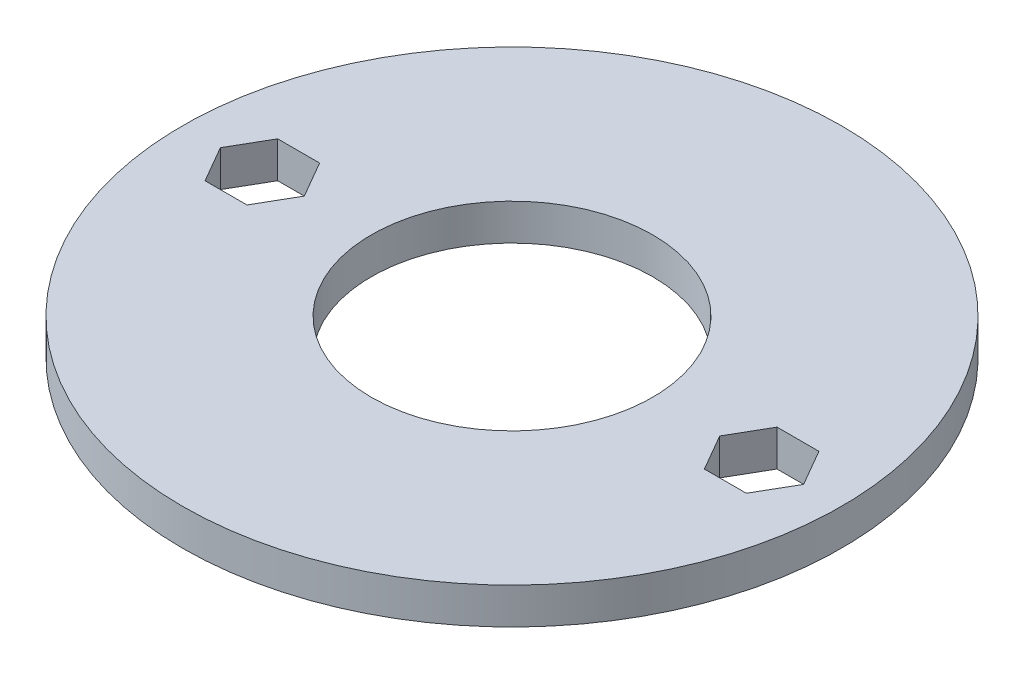
ISO-10303-21;
HEADER;
FILE_DESCRIPTION(('STEP AP214'),'2;1');
FILE_NAME('part.step','',(''),(''),'','','');
FILE_SCHEMA(('AUTOMOTIVE_DESIGN { 1 0 10303 214 1 1 1 1 }'));
ENDSEC;
DATA;
#1=APPLICATION_CONTEXT('core data for automotive mechanical design processes');
#2=APPLICATION_PROTOCOL_DEFINITION('international standard','automotive_design',2000,#1);
#3=PRODUCT_CONTEXT('',#1,'mechanical');
#4=PRODUCT('Part','Part','',(#3));
#5=PRODUCT_RELATED_PRODUCT_CATEGORY('part','',(#4));
#6=PRODUCT_DEFINITION_FORMATION('','',#4);
#7=PRODUCT_DEFINITION_CONTEXT('part definition',#1,'design');
#8=PRODUCT_DEFINITION('design','',#6,#7);
#9=PRODUCT_DEFINITION_SHAPE('','',#8);
#10=(LENGTH_UNIT() NAMED_UNIT(*) SI_UNIT(.MILLI.,.METRE.));
#11=(NAMED_UNIT(*) PLANE_ANGLE_UNIT() SI_UNIT($,.RADIAN.));
#12=(NAMED_UNIT(*) SI_UNIT($,.STERADIAN.) SOLID_ANGLE_UNIT());
#13=UNCERTAINTY_MEASURE_WITH_UNIT(LENGTH_MEASURE(1.E-05),#10,'distance_accuracy_value','');
#14=(GEOMETRIC_REPRESENTATION_CONTEXT(3) GLOBAL_UNCERTAINTY_ASSIGNED_CONTEXT((#13)) GLOBAL_UNIT_ASSIGNED_CONTEXT((#10,
#11,#12)) REPRESENTATION_CONTEXT('',''));
#15=CARTESIAN_POINT('',(0.,0.,0.));
#16=DIRECTION('',(0.,0.,1.));
#17=DIRECTION('',(1.,0.,0.));
#18=AXIS2_PLACEMENT_3D('',#15,#16,#17);
#19=CARTESIAN_POINT('',(0.,4.,0.));
#20=DIRECTION('',(0.,1.,0.));
#21=DIRECTION('',(0.,0.,1.));
#22=AXIS2_PLACEMENT_3D('',#19,#20,#21);
#23=PLANE('',#22);
#24=CARTESIAN_POINT('',(0.,4.,0.));
#25=DIRECTION('',(0.,1.,0.));
#26=DIRECTION('',(0.,0.,1.));
#27=AXIS2_PLACEMENT_3D('',#24,#25,#26);
#28=CIRCLE('',#27,36.3);
#29=CARTESIAN_POINT('',(0.,4.,36.3));
#30=VERTEX_POINT('',#29);
#31=EDGE_CURVE('E11',#30,#30,#28,.T.);
#32=ORIENTED_EDGE('',*,*,#31,.T.);
#33=EDGE_LOOP('',(#32));
#34=FACE_BOUND('',#33,.T.);
#35=CARTESIAN_POINT('',(0.,4.,0.));
#36=DIRECTION('',(0.,1.,0.));
#37=DIRECTION('',(0.,0.,1.));
#38=AXIS2_PLACEMENT_3D('',#35,#36,#37);
#39=CIRCLE('',#38,15.5);
#40=CARTESIAN_POINT('',(0.,4.,15.5));
#41=VERTEX_POINT('',#40);
#42=EDGE_CURVE('E218',#41,#41,#39,.T.);
#43=ORIENTED_EDGE('',*,*,#42,.F.);
#44=EDGE_LOOP('',(#43));
#45=FACE_BOUND('',#44,.T.);
#46=DIRECTION('',(0.500000000000002,0.,-0.866025403784438));
#47=VECTOR('',#46,1.);
#48=CARTESIAN_POINT('',(32.118802153517,4.,0.));
#49=LINE('',#48,#47);
#50=CARTESIAN_POINT('',(29.8094010767585,4.,3.99999999999999));
#51=VERTEX_POINT('',#50);
#52=CARTESIAN_POINT('',(32.118802153517,4.,0.));
#53=VERTEX_POINT('',#52);
#54=EDGE_CURVE('E175',#51,#53,#49,.T.);
#55=ORIENTED_EDGE('',*,*,#54,.F.);
#56=DIRECTION('',(1.,0.,0.));
#57=VECTOR('',#56,1.);
#58=CARTESIAN_POINT('',(29.8094010767585,4.,3.99999999999999));
#59=LINE('',#58,#57);
#60=CARTESIAN_POINT('',(25.1905989232415,4.,3.99999999999999));
#61=VERTEX_POINT('',#60);
#62=EDGE_CURVE('E173',#61,#51,#59,.T.);
#63=ORIENTED_EDGE('',*,*,#62,.F.);
#64=DIRECTION('',(0.500000000000001,0.,0.866025403784438));
#65=VECTOR('',#64,1.);
#66=CARTESIAN_POINT('',(25.1905989232415,4.,3.99999999999999));
#67=LINE('',#66,#65);
#68=CARTESIAN_POINT('',(22.881197846483,4.,0.));
#69=VERTEX_POINT('',#68);
#70=EDGE_CURVE('E185',#69,#61,#67,.T.);
#71=ORIENTED_EDGE('',*,*,#70,.F.);
#72=DIRECTION('',(-0.5,0.,0.866025403784438));
#73=VECTOR('',#72,1.);
#74=CARTESIAN_POINT('',(22.881197846483,4.,0.));
#75=LINE('',#74,#73);
#76=CARTESIAN_POINT('',(25.1905989232415,4.,-4.00000000000001));
#77=VERTEX_POINT('',#76);
#78=EDGE_CURVE('E182',#77,#69,#75,.T.);
#79=ORIENTED_EDGE('',*,*,#78,.F.);
#80=DIRECTION('',(-1.,0.,0.));
#81=VECTOR('',#80,1.);
#82=CARTESIAN_POINT('',(25.1905989232415,4.,-4.00000000000001));
#83=LINE('',#82,#81);
#84=CARTESIAN_POINT('',(29.8094010767585,4.,-4.00000000000001));
#85=VERTEX_POINT('',#84);
#86=EDGE_CURVE('E180',#85,#77,#83,.T.);
#87=ORIENTED_EDGE('',*,*,#86,.F.);
#88=DIRECTION('',(-0.500000000000002,0.,-0.866025403784437));
#89=VECTOR('',#88,1.);
#90=CARTESIAN_POINT('',(29.8094010767585,4.,-4.00000000000001));
#91=LINE('',#90,#89);
#92=EDGE_CURVE('E178',#53,#85,#91,.T.);
#93=ORIENTED_EDGE('',*,*,#92,.F.);
#94=EDGE_LOOP('',(#55,#63,#71,#79,#87,#93));
#95=FACE_BOUND('',#94,.T.);
#96=DIRECTION('',(-0.5,0.,-0.866025403784438));
#97=VECTOR('',#96,1.);
#98=CARTESIAN_POINT('',(-22.881197846483,4.,0.));
#99=LINE('',#98,#97);
#100=CARTESIAN_POINT('',(-22.881197846483,4.,0.));
#101=VERTEX_POINT('',#100);
#102=CARTESIAN_POINT('',(-25.1905989232415,4.,-4.));
#103=VERTEX_POINT('',#102);
#104=EDGE_CURVE('E130',#101,#103,#99,.T.);
#105=ORIENTED_EDGE('',*,*,#104,.F.);
#106=DIRECTION('',(0.500000000000001,0.,-0.866025403784438));
#107=VECTOR('',#106,1.);
#108=CARTESIAN_POINT('',(-25.1905989232415,4.,3.99999999999999));
#109=LINE('',#108,#107);
#110=CARTESIAN_POINT('',(-25.1905989232415,4.,3.99999999999999));
#111=VERTEX_POINT('',#110);
#112=EDGE_CURVE('E122',#111,#101,#109,.T.);
#113=ORIENTED_EDGE('',*,*,#112,.F.);
#114=DIRECTION('',(1.,0.,0.));
#115=VECTOR('',#114,1.);
#116=CARTESIAN_POINT('',(-29.8094010767585,4.,3.99999999999999));
#117=LINE('',#116,#115);
#118=CARTESIAN_POINT('',(-29.8094010767585,4.,3.99999999999999));
#119=VERTEX_POINT('',#118);
#120=EDGE_CURVE('E151',#119,#111,#117,.T.);
#121=ORIENTED_EDGE('',*,*,#120,.F.);
#122=DIRECTION('',(0.500000000000001,0.,0.866025403784438));
#123=VECTOR('',#122,1.);
#124=CARTESIAN_POINT('',(-32.118802153517,4.,0.));
#125=LINE('',#124,#123);
#126=CARTESIAN_POINT('',(-32.118802153517,4.,0.));
#127=VERTEX_POINT('',#126);
#128=EDGE_CURVE('E149',#127,#119,#125,.T.);
#129=ORIENTED_EDGE('',*,*,#128,.F.);
#130=DIRECTION('',(-0.500000000000001,0.,0.866025403784438));
#131=VECTOR('',#130,1.);
#132=CARTESIAN_POINT('',(-29.8094010767585,4.,-4.));
#133=LINE('',#132,#131);
#134=CARTESIAN_POINT('',(-29.8094010767585,4.,-4.));
#135=VERTEX_POINT('',#134);
#136=EDGE_CURVE('E145',#135,#127,#133,.T.);
#137=ORIENTED_EDGE('',*,*,#136,.F.);
#138=DIRECTION('',(-1.,0.,0.));
#139=VECTOR('',#138,1.);
#140=CARTESIAN_POINT('',(-25.1905989232415,4.,-4.));
#141=LINE('',#140,#139);
#142=EDGE_CURVE('E143',#103,#135,#141,.T.);
#143=ORIENTED_EDGE('',*,*,#142,.F.);
#144=EDGE_LOOP('',(#105,#113,#121,#129,#137,#143));
#145=FACE_BOUND('',#144,.T.);
#146=ADVANCED_FACE('F33',(#34,#45,#95,#145),#23,.T.);
#147=CARTESIAN_POINT('',(0.,0.,0.));
#148=DIRECTION('',(0.,1.,0.));
#149=DIRECTION('',(0.,0.,1.));
#150=AXIS2_PLACEMENT_3D('',#147,#148,#149);
#151=PLANE('',#150);
#152=DIRECTION('',(1.,0.,0.));
#153=VECTOR('',#152,1.);
#154=CARTESIAN_POINT('',(29.8094010767585,0.,3.99999999999999));
#155=LINE('',#154,#153);
#156=CARTESIAN_POINT('',(25.1905989232415,0.,3.99999999999999));
#157=VERTEX_POINT('',#156);
#158=CARTESIAN_POINT('',(29.8094010767585,0.,3.99999999999999));
#159=VERTEX_POINT('',#158);
#160=EDGE_CURVE('E138',#157,#159,#155,.T.);
#161=ORIENTED_EDGE('',*,*,#160,.T.);
#162=DIRECTION('',(0.500000000000002,0.,-0.866025403784438));
#163=VECTOR('',#162,1.);
#164=CARTESIAN_POINT('',(32.118802153517,0.,0.));
#165=LINE('',#164,#163);
#166=CARTESIAN_POINT('',(32.118802153517,0.,0.));
#167=VERTEX_POINT('',#166);
#168=EDGE_CURVE('E190',#159,#167,#165,.T.);
#169=ORIENTED_EDGE('',*,*,#168,.T.);
#170=DIRECTION('',(-0.500000000000002,0.,-0.866025403784437));
#171=VECTOR('',#170,1.);
#172=CARTESIAN_POINT('',(29.8094010767585,0.,-4.00000000000001));
#173=LINE('',#172,#171);
#174=CARTESIAN_POINT('',(29.8094010767585,0.,-4.00000000000001));
#175=VERTEX_POINT('',#174);
#176=EDGE_CURVE('E193',#167,#175,#173,.T.);
#177=ORIENTED_EDGE('',*,*,#176,.T.);
#178=DIRECTION('',(-1.,0.,0.));
#179=VECTOR('',#178,1.);
#180=CARTESIAN_POINT('',(25.1905989232415,0.,-4.00000000000001));
#181=LINE('',#180,#179);
#182=CARTESIAN_POINT('',(25.1905989232415,0.,-4.00000000000001));
#183=VERTEX_POINT('',#182);
#184=EDGE_CURVE('E196',#175,#183,#181,.T.);
#185=ORIENTED_EDGE('',*,*,#184,.T.);
#186=DIRECTION('',(-0.5,0.,0.866025403784438));
#187=VECTOR('',#186,1.);
#188=CARTESIAN_POINT('',(22.881197846483,0.,0.));
#189=LINE('',#188,#187);
#190=CARTESIAN_POINT('',(22.881197846483,0.,0.));
#191=VERTEX_POINT('',#190);
#192=EDGE_CURVE('E199',#183,#191,#189,.T.);
#193=ORIENTED_EDGE('',*,*,#192,.T.);
#194=DIRECTION('',(0.500000000000001,0.,0.866025403784438));
#195=VECTOR('',#194,1.);
#196=CARTESIAN_POINT('',(25.1905989232415,0.,3.99999999999999));
#197=LINE('',#196,#195);
#198=EDGE_CURVE('E176',#191,#157,#197,.T.);
#199=ORIENTED_EDGE('',*,*,#198,.T.);
#200=EDGE_LOOP('',(#161,#169,#177,#185,#193,#199));
#201=FACE_BOUND('',#200,.T.);
#202=CARTESIAN_POINT('',(0.,0.,0.));
#203=DIRECTION('',(0.,1.,0.));
#204=DIRECTION('',(0.,0.,1.));
#205=AXIS2_PLACEMENT_3D('',#202,#203,#204);
#206=CIRCLE('',#205,36.3);
#207=CARTESIAN_POINT('',(0.,0.,36.3));
#208=VERTEX_POINT('',#207);
#209=EDGE_CURVE('E37',#208,#208,#206,.T.);
#210=ORIENTED_EDGE('',*,*,#209,.F.);
#211=EDGE_LOOP('',(#210));
#212=FACE_BOUND('',#211,.T.);
#213=CARTESIAN_POINT('',(0.,0.,0.));
#214=DIRECTION('',(0.,1.,0.));
#215=DIRECTION('',(0.,0.,1.));
#216=AXIS2_PLACEMENT_3D('',#213,#214,#215);
#217=CIRCLE('',#216,15.5);
#218=CARTESIAN_POINT('',(0.,0.,15.5));
#219=VERTEX_POINT('',#218);
#220=EDGE_CURVE('E217',#219,#219,#217,.T.);
#221=ORIENTED_EDGE('',*,*,#220,.T.);
#222=EDGE_LOOP('',(#221));
#223=FACE_BOUND('',#222,.T.);
#224=DIRECTION('',(0.500000000000001,0.,-0.866025403784438));
#225=VECTOR('',#224,1.);
#226=CARTESIAN_POINT('',(-25.1905989232415,0.,3.99999999999999));
#227=LINE('',#226,#225);
#228=CARTESIAN_POINT('',(-25.1905989232415,0.,3.99999999999999));
#229=VERTEX_POINT('',#228);
#230=CARTESIAN_POINT('',(-22.881197846483,0.,0.));
#231=VERTEX_POINT('',#230);
#232=EDGE_CURVE('E56',#229,#231,#227,.T.);
#233=ORIENTED_EDGE('',*,*,#232,.T.);
#234=DIRECTION('',(-0.5,0.,-0.866025403784438));
#235=VECTOR('',#234,1.);
#236=CARTESIAN_POINT('',(-22.881197846483,0.,0.));
#237=LINE('',#236,#235);
#238=CARTESIAN_POINT('',(-25.1905989232415,0.,-4.));
#239=VERTEX_POINT('',#238);
#240=EDGE_CURVE('E137',#231,#239,#237,.T.);
#241=ORIENTED_EDGE('',*,*,#240,.T.);
#242=DIRECTION('',(-1.,0.,0.));
#243=VECTOR('',#242,1.);
#244=CARTESIAN_POINT('',(-25.1905989232415,0.,-4.));
#245=LINE('',#244,#243);
#246=CARTESIAN_POINT('',(-29.8094010767585,0.,-4.));
#247=VERTEX_POINT('',#246);
#248=EDGE_CURVE('E155',#239,#247,#245,.T.);
#249=ORIENTED_EDGE('',*,*,#248,.T.);
#250=DIRECTION('',(-0.500000000000001,0.,0.866025403784438));
#251=VECTOR('',#250,1.);
#252=CARTESIAN_POINT('',(-29.8094010767585,0.,-4.));
#253=LINE('',#252,#251);
#254=CARTESIAN_POINT('',(-32.118802153517,0.,0.));
#255=VERTEX_POINT('',#254);
#256=EDGE_CURVE('E158',#247,#255,#253,.T.);
#257=ORIENTED_EDGE('',*,*,#256,.T.);
#258=DIRECTION('',(0.500000000000001,0.,0.866025403784438));
#259=VECTOR('',#258,1.);
#260=CARTESIAN_POINT('',(-32.118802153517,0.,0.));
#261=LINE('',#260,#259);
#262=CARTESIAN_POINT('',(-29.8094010767585,0.,3.99999999999999));
#263=VERTEX_POINT('',#262);
#264=EDGE_CURVE('E161',#255,#263,#261,.T.);
#265=ORIENTED_EDGE('',*,*,#264,.T.);
#266=DIRECTION('',(1.,0.,0.));
#267=VECTOR('',#266,1.);
#268=CARTESIAN_POINT('',(-29.8094010767585,0.,3.99999999999999));
#269=LINE('',#268,#267);
#270=EDGE_CURVE('E131',#263,#229,#269,.T.);
#271=ORIENTED_EDGE('',*,*,#270,.T.);
#272=EDGE_LOOP('',(#233,#241,#249,#257,#265,#271));
#273=FACE_BOUND('',#272,.T.);
#274=ADVANCED_FACE('F224',(#201,#212,#223,#273),#151,.F.);
#275=CARTESIAN_POINT('',(0.,4.,0.));
#276=DIRECTION('',(0.,-1.,0.));
#277=DIRECTION('',(0.,0.,-1.));
#278=AXIS2_PLACEMENT_3D('',#275,#276,#277);
#279=CYLINDRICAL_SURFACE('',#278,36.3);
#280=ORIENTED_EDGE('',*,*,#31,.F.);
#281=EDGE_LOOP('',(#280));
#282=FACE_BOUND('',#281,.T.);
#283=ORIENTED_EDGE('',*,*,#209,.T.);
#284=EDGE_LOOP('',(#283));
#285=FACE_BOUND('',#284,.T.);
#286=ADVANCED_FACE('F35',(#282,#285),#279,.T.);
#287=CARTESIAN_POINT('',(0.,4.,0.));
#288=DIRECTION('',(0.,-1.,0.));
#289=DIRECTION('',(0.,0.,-1.));
#290=AXIS2_PLACEMENT_3D('',#287,#288,#289);
#291=CYLINDRICAL_SURFACE('',#290,15.5);
#292=ORIENTED_EDGE('',*,*,#42,.T.);
#293=EDGE_LOOP('',(#292));
#294=FACE_BOUND('',#293,.T.);
#295=ORIENTED_EDGE('',*,*,#220,.F.);
#296=EDGE_LOOP('',(#295));
#297=FACE_BOUND('',#296,.T.);
#298=ADVANCED_FACE('F227',(#294,#297),#291,.F.);
#299=CARTESIAN_POINT('',(29.8094010767585,4.,3.99999999999999));
#300=DIRECTION('',(0.,0.,-1.));
#301=DIRECTION('',(-1.,0.,0.));
#302=AXIS2_PLACEMENT_3D('',#299,#300,#301);
#303=PLANE('',#302);
#304=ORIENTED_EDGE('',*,*,#160,.F.);
#305=DIRECTION('',(0.,-1.,0.));
#306=VECTOR('',#305,1.);
#307=CARTESIAN_POINT('',(25.1905989232415,4.,3.99999999999999));
#308=LINE('',#307,#306);
#309=EDGE_CURVE('E187',#61,#157,#308,.T.);
#310=ORIENTED_EDGE('',*,*,#309,.F.);
#311=ORIENTED_EDGE('',*,*,#62,.T.);
#312=DIRECTION('',(0.,-1.,0.));
#313=VECTOR('',#312,1.);
#314=CARTESIAN_POINT('',(29.8094010767585,4.,3.99999999999999));
#315=LINE('',#314,#313);
#316=EDGE_CURVE('E214',#51,#159,#315,.T.);
#317=ORIENTED_EDGE('',*,*,#316,.T.);
#318=EDGE_LOOP('',(#304,#310,#311,#317));
#319=FACE_BOUND('',#318,.T.);
#320=ADVANCED_FACE('F229',(#319),#303,.T.);
#321=CARTESIAN_POINT('',(32.118802153517,4.,0.));
#322=DIRECTION('',(-0.866025403784438,0.,-0.500000000000002));
#323=DIRECTION('',(-0.500000000000002,0.,0.866025403784438));
#324=AXIS2_PLACEMENT_3D('',#321,#322,#323);
#325=PLANE('',#324);
#326=ORIENTED_EDGE('',*,*,#168,.F.);
#327=ORIENTED_EDGE('',*,*,#316,.F.);
#328=ORIENTED_EDGE('',*,*,#54,.T.);
#329=DIRECTION('',(0.,-1.,0.));
#330=VECTOR('',#329,1.);
#331=CARTESIAN_POINT('',(32.118802153517,4.,0.));
#332=LINE('',#331,#330);
#333=EDGE_CURVE('E212',#53,#167,#332,.T.);
#334=ORIENTED_EDGE('',*,*,#333,.T.);
#335=EDGE_LOOP('',(#326,#327,#328,#334));
#336=FACE_BOUND('',#335,.T.);
#337=ADVANCED_FACE('F236',(#336),#325,.T.);
#338=CARTESIAN_POINT('',(29.8094010767585,4.,-4.00000000000001));
#339=DIRECTION('',(-0.866025403784438,0.,0.500000000000002));
#340=DIRECTION('',(0.500000000000002,0.,0.866025403784437));
#341=AXIS2_PLACEMENT_3D('',#338,#339,#340);
#342=PLANE('',#341);
#343=ORIENTED_EDGE('',*,*,#176,.F.);
#344=ORIENTED_EDGE('',*,*,#333,.F.);
#345=ORIENTED_EDGE('',*,*,#92,.T.);
#346=DIRECTION('',(0.,-1.,0.));
#347=VECTOR('',#346,1.);
#348=CARTESIAN_POINT('',(29.8094010767585,4.,-4.00000000000001));
#349=LINE('',#348,#347);
#350=EDGE_CURVE('E210',#85,#175,#349,.T.);
#351=ORIENTED_EDGE('',*,*,#350,.T.);
#352=EDGE_LOOP('',(#343,#344,#345,#351));
#353=FACE_BOUND('',#352,.T.);
#354=ADVANCED_FACE('F261',(#353),#342,.T.);
#355=CARTESIAN_POINT('',(25.1905989232415,4.,-4.00000000000001));
#356=DIRECTION('',(0.,0.,1.));
#357=DIRECTION('',(1.,0.,0.));
#358=AXIS2_PLACEMENT_3D('',#355,#356,#357);
#359=PLANE('',#358);
#360=ORIENTED_EDGE('',*,*,#184,.F.);
#361=ORIENTED_EDGE('',*,*,#350,.F.);
#362=ORIENTED_EDGE('',*,*,#86,.T.);
#363=DIRECTION('',(0.,-1.,0.));
#364=VECTOR('',#363,1.);
#365=CARTESIAN_POINT('',(25.1905989232415,4.,-4.00000000000001));
#366=LINE('',#365,#364);
#367=EDGE_CURVE('E208',#77,#183,#366,.T.);
#368=ORIENTED_EDGE('',*,*,#367,.T.);
#369=EDGE_LOOP('',(#360,#361,#362,#368));
#370=FACE_BOUND('',#369,.T.);
#371=ADVANCED_FACE('F275',(#370),#359,.T.);
#372=CARTESIAN_POINT('',(22.881197846483,4.,0.));
#373=DIRECTION('',(0.866025403784438,0.,0.5));
#374=DIRECTION('',(0.5,0.,-0.866025403784439));
#375=AXIS2_PLACEMENT_3D('',#372,#373,#374);
#376=PLANE('',#375);
#377=ORIENTED_EDGE('',*,*,#192,.F.);
#378=ORIENTED_EDGE('',*,*,#367,.F.);
#379=ORIENTED_EDGE('',*,*,#78,.T.);
#380=DIRECTION('',(0.,-1.,0.));
#381=VECTOR('',#380,1.);
#382=CARTESIAN_POINT('',(22.881197846483,4.,0.));
#383=LINE('',#382,#381);
#384=EDGE_CURVE('E206',#69,#191,#383,.T.);
#385=ORIENTED_EDGE('',*,*,#384,.T.);
#386=EDGE_LOOP('',(#377,#378,#379,#385));
#387=FACE_BOUND('',#386,.T.);
#388=ADVANCED_FACE('F272',(#387),#376,.T.);
#389=CARTESIAN_POINT('',(25.1905989232415,4.,3.99999999999999));
#390=DIRECTION('',(0.866025403784438,0.,-0.500000000000001));
#391=DIRECTION('',(-0.500000000000001,0.,-0.866025403784438));
#392=AXIS2_PLACEMENT_3D('',#389,#390,#391);
#393=PLANE('',#392);
#394=ORIENTED_EDGE('',*,*,#198,.F.);
#395=ORIENTED_EDGE('',*,*,#384,.F.);
#396=ORIENTED_EDGE('',*,*,#70,.T.);
#397=ORIENTED_EDGE('',*,*,#309,.T.);
#398=EDGE_LOOP('',(#394,#395,#396,#397));
#399=FACE_BOUND('',#398,.T.);
#400=ADVANCED_FACE('F268',(#399),#393,.T.);
#401=CARTESIAN_POINT('',(-25.1905989232415,4.,3.99999999999999));
#402=DIRECTION('',(-0.866025403784438,0.,-0.500000000000001));
#403=DIRECTION('',(-0.500000000000001,0.,0.866025403784438));
#404=AXIS2_PLACEMENT_3D('',#401,#402,#403);
#405=PLANE('',#404);
#406=ORIENTED_EDGE('',*,*,#232,.F.);
#407=DIRECTION('',(0.,-1.,0.));
#408=VECTOR('',#407,1.);
#409=CARTESIAN_POINT('',(-25.1905989232415,4.,3.99999999999999));
#410=LINE('',#409,#408);
#411=EDGE_CURVE('E126',#111,#229,#410,.T.);
#412=ORIENTED_EDGE('',*,*,#411,.F.);
#413=ORIENTED_EDGE('',*,*,#112,.T.);
#414=DIRECTION('',(0.,-1.,0.));
#415=VECTOR('',#414,1.);
#416=CARTESIAN_POINT('',(-22.881197846483,4.,0.));
#417=LINE('',#416,#415);
#418=EDGE_CURVE('E125',#101,#231,#417,.T.);
#419=ORIENTED_EDGE('',*,*,#418,.T.);
#420=EDGE_LOOP('',(#406,#412,#413,#419));
#421=FACE_BOUND('',#420,.T.);
#422=ADVANCED_FACE('F124',(#421),#405,.T.);
#423=CARTESIAN_POINT('',(-22.881197846483,4.,0.));
#424=DIRECTION('',(-0.866025403784438,0.,0.5));
#425=DIRECTION('',(0.5,0.,0.866025403784439));
#426=AXIS2_PLACEMENT_3D('',#423,#424,#425);
#427=PLANE('',#426);
#428=ORIENTED_EDGE('',*,*,#240,.F.);
#429=ORIENTED_EDGE('',*,*,#418,.F.);
#430=ORIENTED_EDGE('',*,*,#104,.T.);
#431=DIRECTION('',(0.,-1.,0.));
#432=VECTOR('',#431,1.);
#433=CARTESIAN_POINT('',(-25.1905989232415,4.,-4.));
#434=LINE('',#433,#432);
#435=EDGE_CURVE('E139',#103,#239,#434,.T.);
#436=ORIENTED_EDGE('',*,*,#435,.T.);
#437=EDGE_LOOP('',(#428,#429,#430,#436));
#438=FACE_BOUND('',#437,.T.);
#439=ADVANCED_FACE('F134',(#438),#427,.T.);
#440=CARTESIAN_POINT('',(-25.1905989232415,4.,-4.));
#441=DIRECTION('',(0.,0.,1.));
#442=DIRECTION('',(1.,0.,0.));
#443=AXIS2_PLACEMENT_3D('',#440,#441,#442);
#444=PLANE('',#443);
#445=ORIENTED_EDGE('',*,*,#248,.F.);
#446=ORIENTED_EDGE('',*,*,#435,.F.);
#447=ORIENTED_EDGE('',*,*,#142,.T.);
#448=DIRECTION('',(0.,-1.,0.));
#449=VECTOR('',#448,1.);
#450=CARTESIAN_POINT('',(-29.8094010767585,4.,-4.));
#451=LINE('',#450,#449);
#452=EDGE_CURVE('E170',#135,#247,#451,.T.);
#453=ORIENTED_EDGE('',*,*,#452,.T.);
#454=EDGE_LOOP('',(#445,#446,#447,#453));
#455=FACE_BOUND('',#454,.T.);
#456=ADVANCED_FACE('F329',(#455),#444,.T.);
#457=CARTESIAN_POINT('',(-29.8094010767585,4.,-4.));
#458=DIRECTION('',(0.866025403784438,0.,0.500000000000001));
#459=DIRECTION('',(0.500000000000001,0.,-0.866025403784438));
#460=AXIS2_PLACEMENT_3D('',#457,#458,#459);
#461=PLANE('',#460);
#462=ORIENTED_EDGE('',*,*,#256,.F.);
#463=ORIENTED_EDGE('',*,*,#452,.F.);
#464=ORIENTED_EDGE('',*,*,#136,.T.);
#465=DIRECTION('',(0.,-1.,0.));
#466=VECTOR('',#465,1.);
#467=CARTESIAN_POINT('',(-32.118802153517,4.,0.));
#468=LINE('',#467,#466);
#469=EDGE_CURVE('E168',#127,#255,#468,.T.);
#470=ORIENTED_EDGE('',*,*,#469,.T.);
#471=EDGE_LOOP('',(#462,#463,#464,#470));
#472=FACE_BOUND('',#471,.T.);
#473=ADVANCED_FACE('F338',(#472),#461,.T.);
#474=CARTESIAN_POINT('',(-32.118802153517,4.,0.));
#475=DIRECTION('',(0.866025403784438,0.,-0.500000000000001));
#476=DIRECTION('',(-0.500000000000001,0.,-0.866025403784438));
#477=AXIS2_PLACEMENT_3D('',#474,#475,#476);
#478=PLANE('',#477);
#479=ORIENTED_EDGE('',*,*,#264,.F.);
#480=ORIENTED_EDGE('',*,*,#469,.F.);
#481=ORIENTED_EDGE('',*,*,#128,.T.);
#482=DIRECTION('',(0.,-1.,0.));
#483=VECTOR('',#482,1.);
#484=CARTESIAN_POINT('',(-29.8094010767585,4.,3.99999999999999));
#485=LINE('',#484,#483);
#486=EDGE_CURVE('E48',#119,#263,#485,.T.);
#487=ORIENTED_EDGE('',*,*,#486,.T.);
#488=EDGE_LOOP('',(#479,#480,#481,#487));
#489=FACE_BOUND('',#488,.T.);
#490=ADVANCED_FACE('F348',(#489),#478,.T.);
#491=CARTESIAN_POINT('',(-29.8094010767585,4.,3.99999999999999));
#492=DIRECTION('',(0.,0.,-1.));
#493=DIRECTION('',(-1.,0.,0.));
#494=AXIS2_PLACEMENT_3D('',#491,#492,#493);
#495=PLANE('',#494);
#496=ORIENTED_EDGE('',*,*,#270,.F.);
#497=ORIENTED_EDGE('',*,*,#486,.F.);
#498=ORIENTED_EDGE('',*,*,#120,.T.);
#499=ORIENTED_EDGE('',*,*,#411,.T.);
#500=EDGE_LOOP('',(#496,#497,#498,#499));
#501=FACE_BOUND('',#500,.T.);
#502=ADVANCED_FACE('F358',(#501),#495,.T.);
#503=CLOSED_SHELL('',(#146,#274,#286,#298,#320,#337,#354,#371,#388,#400,#422,#439,#456,#473,
#490,#502));
#504=MANIFOLD_SOLID_BREP('B2',#503);
#505=ADVANCED_BREP_SHAPE_REPRESENTATION('',(#18,#504),#14);
#506=SHAPE_DEFINITION_REPRESENTATION(#9,#505);
ENDSEC;
END-ISO-10303-21;
